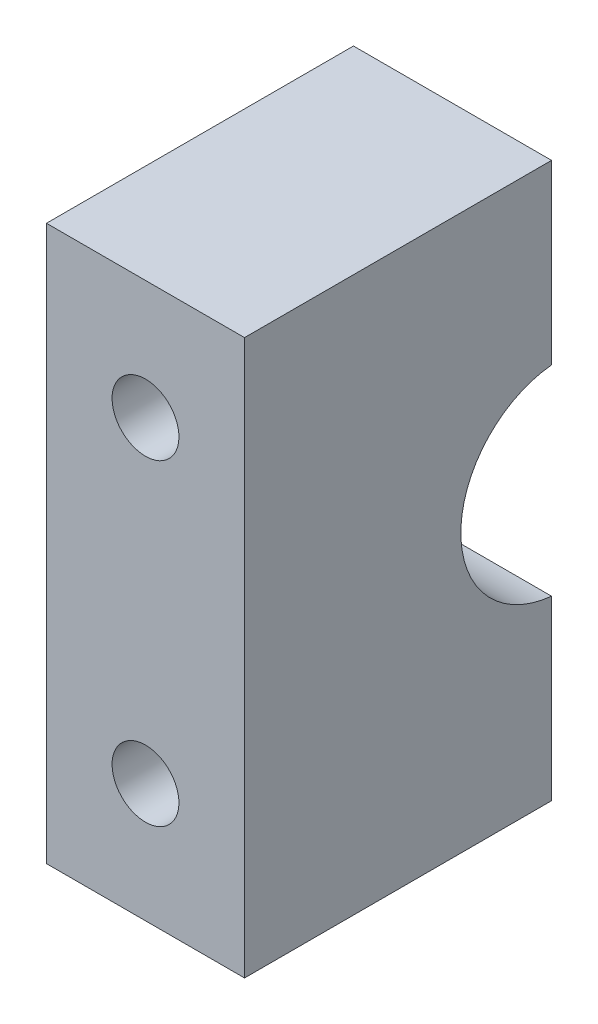
ISO-10303-21;
HEADER;
FILE_DESCRIPTION(('STEP AP214'),'2;1');
FILE_NAME('part.step','',(''),(''),'','','');
FILE_SCHEMA(('AUTOMOTIVE_DESIGN { 1 0 10303 214 1 1 1 1 }'));
ENDSEC;
DATA;
#1=APPLICATION_CONTEXT('core data for automotive mechanical design processes');
#2=APPLICATION_PROTOCOL_DEFINITION('international standard','automotive_design',2000,#1);
#3=PRODUCT_CONTEXT('',#1,'mechanical');
#4=PRODUCT('Part','Part','',(#3));
#5=PRODUCT_RELATED_PRODUCT_CATEGORY('part','',(#4));
#6=PRODUCT_DEFINITION_FORMATION('','',#4);
#7=PRODUCT_DEFINITION_CONTEXT('part definition',#1,'design');
#8=PRODUCT_DEFINITION('design','',#6,#7);
#9=PRODUCT_DEFINITION_SHAPE('','',#8);
#10=(LENGTH_UNIT() NAMED_UNIT(*) SI_UNIT(.MILLI.,.METRE.));
#11=(NAMED_UNIT(*) PLANE_ANGLE_UNIT() SI_UNIT($,.RADIAN.));
#12=(NAMED_UNIT(*) SI_UNIT($,.STERADIAN.) SOLID_ANGLE_UNIT());
#13=UNCERTAINTY_MEASURE_WITH_UNIT(LENGTH_MEASURE(1.E-05),#10,'distance_accuracy_value','');
#14=(GEOMETRIC_REPRESENTATION_CONTEXT(3) GLOBAL_UNCERTAINTY_ASSIGNED_CONTEXT((#13)) GLOBAL_UNIT_ASSIGNED_CONTEXT((#10,
#11,#12)) REPRESENTATION_CONTEXT('',''));
#15=CARTESIAN_POINT('',(0.,0.,0.));
#16=DIRECTION('',(0.,0.,1.));
#17=DIRECTION('',(1.,0.,0.));
#18=AXIS2_PLACEMENT_3D('',#15,#16,#17);
#19=CARTESIAN_POINT('',(15.875,0.,0.));
#20=DIRECTION('',(-1.,0.,0.));
#21=DIRECTION('',(0.,0.,1.));
#22=AXIS2_PLACEMENT_3D('',#19,#20,#21);
#23=CYLINDRICAL_SURFACE('',#22,16.129);
#24=CARTESIAN_POINT('',(-15.875,0.,0.));
#25=DIRECTION('',(-1.,0.,0.));
#26=DIRECTION('',(0.,0.,-1.));
#27=AXIS2_PLACEMENT_3D('',#24,#25,#26);
#28=CIRCLE('',#27,16.129);
#29=CARTESIAN_POINT('',(-15.875,-16.0506848685656,1.58749999999999));
#30=VERTEX_POINT('',#29);
#31=CARTESIAN_POINT('',(-15.875,16.0506848685656,1.58749999999999));
#32=VERTEX_POINT('',#31);
#33=EDGE_CURVE('E92',#30,#32,#28,.T.);
#34=ORIENTED_EDGE('',*,*,#33,.T.);
#35=DIRECTION('',(-1.,0.,0.));
#36=VECTOR('',#35,1.);
#37=CARTESIAN_POINT('',(15.875,16.0506848685656,1.58749999999999));
#38=LINE('',#37,#36);
#39=CARTESIAN_POINT('',(15.875,16.0506848685656,1.58749999999999));
#40=VERTEX_POINT('',#39);
#41=EDGE_CURVE('E11',#40,#32,#38,.T.);
#42=ORIENTED_EDGE('',*,*,#41,.F.);
#43=CARTESIAN_POINT('',(15.875,0.,0.));
#44=DIRECTION('',(-1.,0.,0.));
#45=DIRECTION('',(0.,0.,-1.));
#46=AXIS2_PLACEMENT_3D('',#43,#44,#45);
#47=CIRCLE('',#46,16.129);
#48=CARTESIAN_POINT('',(15.875,-16.0506848685656,1.58749999999999));
#49=VERTEX_POINT('',#48);
#50=EDGE_CURVE('E120',#49,#40,#47,.T.);
#51=ORIENTED_EDGE('',*,*,#50,.F.);
#52=DIRECTION('',(-1.,0.,0.));
#53=VECTOR('',#52,1.);
#54=CARTESIAN_POINT('',(15.875,-16.0506848685656,1.58749999999999));
#55=LINE('',#54,#53);
#56=EDGE_CURVE('E105',#49,#30,#55,.T.);
#57=ORIENTED_EDGE('',*,*,#56,.T.);
#58=EDGE_LOOP('',(#34,#42,#51,#57));
#59=FACE_BOUND('',#58,.T.);
#60=ADVANCED_FACE('F36',(#59),#23,.F.);
#61=CARTESIAN_POINT('',(15.875,44.45,1.58749999999998));
#62=DIRECTION('',(0.,0.,1.));
#63=DIRECTION('',(0.,-1.,0.));
#64=AXIS2_PLACEMENT_3D('',#61,#62,#63);
#65=PLANE('',#64);
#66=CARTESIAN_POINT('',(0.,25.4,1.58749999999998));
#67=DIRECTION('',(0.,0.,-1.));
#68=DIRECTION('',(0.,1.,0.));
#69=AXIS2_PLACEMENT_3D('',#66,#67,#68);
#70=CIRCLE('',#69,7.14375);
#71=CARTESIAN_POINT('',(0.,32.54375,1.58749999999998));
#72=VERTEX_POINT('',#71);
#73=EDGE_CURVE('E186',#72,#72,#70,.T.);
#74=ORIENTED_EDGE('',*,*,#73,.F.);
#75=EDGE_LOOP('',(#74));
#76=FACE_BOUND('',#75,.T.);
#77=DIRECTION('',(0.,1.,0.));
#78=VECTOR('',#77,1.);
#79=CARTESIAN_POINT('',(-15.875,44.45,1.58749999999998));
#80=LINE('',#79,#78);
#81=CARTESIAN_POINT('',(-15.875,44.45,1.58749999999998));
#82=VERTEX_POINT('',#81);
#83=EDGE_CURVE('E88',#32,#82,#80,.T.);
#84=ORIENTED_EDGE('',*,*,#83,.T.);
#85=DIRECTION('',(-1.,0.,0.));
#86=VECTOR('',#85,1.);
#87=CARTESIAN_POINT('',(15.875,44.45,1.58749999999998));
#88=LINE('',#87,#86);
#89=CARTESIAN_POINT('',(15.875,44.45,1.58749999999998));
#90=VERTEX_POINT('',#89);
#91=EDGE_CURVE('E43',#90,#82,#88,.T.);
#92=ORIENTED_EDGE('',*,*,#91,.F.);
#93=DIRECTION('',(0.,1.,0.));
#94=VECTOR('',#93,1.);
#95=CARTESIAN_POINT('',(15.875,44.45,1.58749999999998));
#96=LINE('',#95,#94);
#97=EDGE_CURVE('E101',#40,#90,#96,.T.);
#98=ORIENTED_EDGE('',*,*,#97,.F.);
#99=ORIENTED_EDGE('',*,*,#41,.T.);
#100=EDGE_LOOP('',(#84,#92,#98,#99));
#101=FACE_BOUND('',#100,.T.);
#102=ADVANCED_FACE('F100',(#76,#101),#65,.F.);
#103=CARTESIAN_POINT('',(15.875,44.45,1.58749999999998));
#104=DIRECTION('',(0.,-1.,0.));
#105=DIRECTION('',(0.,0.,-1.));
#106=AXIS2_PLACEMENT_3D('',#103,#104,#105);
#107=PLANE('',#106);
#108=DIRECTION('',(0.,0.,1.));
#109=VECTOR('',#108,1.);
#110=CARTESIAN_POINT('',(-15.875,44.45,1.58749999999998));
#111=LINE('',#110,#109);
#112=CARTESIAN_POINT('',(-15.875,44.45,50.8));
#113=VERTEX_POINT('',#112);
#114=EDGE_CURVE('E94',#82,#113,#111,.T.);
#115=ORIENTED_EDGE('',*,*,#114,.T.);
#116=DIRECTION('',(-1.,0.,0.));
#117=VECTOR('',#116,1.);
#118=CARTESIAN_POINT('',(15.875,44.45,50.8));
#119=LINE('',#118,#117);
#120=CARTESIAN_POINT('',(15.875,44.45,50.8));
#121=VERTEX_POINT('',#120);
#122=EDGE_CURVE('E136',#121,#113,#119,.T.);
#123=ORIENTED_EDGE('',*,*,#122,.F.);
#124=DIRECTION('',(0.,0.,1.));
#125=VECTOR('',#124,1.);
#126=CARTESIAN_POINT('',(15.875,44.45,1.58749999999998));
#127=LINE('',#126,#125);
#128=EDGE_CURVE('E123',#90,#121,#127,.T.);
#129=ORIENTED_EDGE('',*,*,#128,.F.);
#130=ORIENTED_EDGE('',*,*,#91,.T.);
#131=EDGE_LOOP('',(#115,#123,#129,#130));
#132=FACE_BOUND('',#131,.T.);
#133=ADVANCED_FACE('F140',(#132),#107,.F.);
#134=CARTESIAN_POINT('',(15.875,44.45,50.8));
#135=DIRECTION('',(0.,0.,-1.));
#136=DIRECTION('',(-1.,0.,0.));
#137=AXIS2_PLACEMENT_3D('',#134,#135,#136);
#138=PLANE('',#137);
#139=CARTESIAN_POINT('',(0.,25.4,50.8));
#140=DIRECTION('',(0.,0.,-1.));
#141=DIRECTION('',(0.,1.,0.));
#142=AXIS2_PLACEMENT_3D('',#139,#140,#141);
#143=CIRCLE('',#142,5.35812999999999);
#144=CARTESIAN_POINT('',(0.,30.75813,50.8));
#145=VERTEX_POINT('',#144);
#146=EDGE_CURVE('E180',#145,#145,#143,.T.);
#147=ORIENTED_EDGE('',*,*,#146,.T.);
#148=EDGE_LOOP('',(#147));
#149=FACE_BOUND('',#148,.T.);
#150=CARTESIAN_POINT('',(0.,-25.4,50.8));
#151=DIRECTION('',(0.,0.,-1.));
#152=DIRECTION('',(0.,1.,0.));
#153=AXIS2_PLACEMENT_3D('',#150,#151,#152);
#154=CIRCLE('',#153,5.35812999999999);
#155=CARTESIAN_POINT('',(0.,-20.04187,50.8));
#156=VERTEX_POINT('',#155);
#157=EDGE_CURVE('E183',#156,#156,#154,.T.);
#158=ORIENTED_EDGE('',*,*,#157,.T.);
#159=EDGE_LOOP('',(#158));
#160=FACE_BOUND('',#159,.T.);
#161=DIRECTION('',(0.,-1.,0.));
#162=VECTOR('',#161,1.);
#163=CARTESIAN_POINT('',(-15.875,44.45,50.8));
#164=LINE('',#163,#162);
#165=CARTESIAN_POINT('',(-15.875,-44.45,50.8));
#166=VERTEX_POINT('',#165);
#167=EDGE_CURVE('E114',#113,#166,#164,.T.);
#168=ORIENTED_EDGE('',*,*,#167,.T.);
#169=DIRECTION('',(-1.,0.,0.));
#170=VECTOR('',#169,1.);
#171=CARTESIAN_POINT('',(15.875,-44.45,50.8));
#172=LINE('',#171,#170);
#173=CARTESIAN_POINT('',(15.875,-44.45,50.8));
#174=VERTEX_POINT('',#173);
#175=EDGE_CURVE('E133',#174,#166,#172,.T.);
#176=ORIENTED_EDGE('',*,*,#175,.F.);
#177=DIRECTION('',(0.,-1.,0.));
#178=VECTOR('',#177,1.);
#179=CARTESIAN_POINT('',(15.875,44.45,50.8));
#180=LINE('',#179,#178);
#181=EDGE_CURVE('E125',#121,#174,#180,.T.);
#182=ORIENTED_EDGE('',*,*,#181,.F.);
#183=ORIENTED_EDGE('',*,*,#122,.T.);
#184=EDGE_LOOP('',(#168,#176,#182,#183));
#185=FACE_BOUND('',#184,.T.);
#186=ADVANCED_FACE('F146',(#149,#160,#185),#138,.F.);
#187=CARTESIAN_POINT('',(15.875,-44.45,50.8));
#188=DIRECTION('',(0.,1.,0.));
#189=DIRECTION('',(0.,0.,1.));
#190=AXIS2_PLACEMENT_3D('',#187,#188,#189);
#191=PLANE('',#190);
#192=DIRECTION('',(0.,0.,-1.));
#193=VECTOR('',#192,1.);
#194=CARTESIAN_POINT('',(-15.875,-44.45,50.8));
#195=LINE('',#194,#193);
#196=CARTESIAN_POINT('',(-15.875,-44.45,1.58749999999998));
#197=VERTEX_POINT('',#196);
#198=EDGE_CURVE('E116',#166,#197,#195,.T.);
#199=ORIENTED_EDGE('',*,*,#198,.T.);
#200=DIRECTION('',(-1.,0.,0.));
#201=VECTOR('',#200,1.);
#202=CARTESIAN_POINT('',(15.875,-44.45,1.58749999999998));
#203=LINE('',#202,#201);
#204=CARTESIAN_POINT('',(15.875,-44.45,1.58749999999998));
#205=VERTEX_POINT('',#204);
#206=EDGE_CURVE('E130',#205,#197,#203,.T.);
#207=ORIENTED_EDGE('',*,*,#206,.F.);
#208=DIRECTION('',(0.,0.,-1.));
#209=VECTOR('',#208,1.);
#210=CARTESIAN_POINT('',(15.875,-44.45,50.8));
#211=LINE('',#210,#209);
#212=EDGE_CURVE('E55',#174,#205,#211,.T.);
#213=ORIENTED_EDGE('',*,*,#212,.F.);
#214=ORIENTED_EDGE('',*,*,#175,.T.);
#215=EDGE_LOOP('',(#199,#207,#213,#214));
#216=FACE_BOUND('',#215,.T.);
#217=ADVANCED_FACE('F149',(#216),#191,.F.);
#218=CARTESIAN_POINT('',(15.875,-16.0506848685656,1.58749999999999));
#219=DIRECTION('',(0.,0.,1.));
#220=DIRECTION('',(0.,-1.,0.));
#221=AXIS2_PLACEMENT_3D('',#218,#219,#220);
#222=PLANE('',#221);
#223=CARTESIAN_POINT('',(0.,-25.4,1.58749999999998));
#224=DIRECTION('',(0.,0.,-1.));
#225=DIRECTION('',(0.,1.,0.));
#226=AXIS2_PLACEMENT_3D('',#223,#224,#225);
#227=CIRCLE('',#226,7.14375);
#228=CARTESIAN_POINT('',(0.,-18.25625,1.58749999999998));
#229=VERTEX_POINT('',#228);
#230=EDGE_CURVE('E106',#229,#229,#227,.T.);
#231=ORIENTED_EDGE('',*,*,#230,.F.);
#232=EDGE_LOOP('',(#231));
#233=FACE_BOUND('',#232,.T.);
#234=DIRECTION('',(0.,1.,0.));
#235=VECTOR('',#234,1.);
#236=CARTESIAN_POINT('',(-15.875,-16.0506848685656,1.58749999999999));
#237=LINE('',#236,#235);
#238=EDGE_CURVE('E118',#197,#30,#237,.T.);
#239=ORIENTED_EDGE('',*,*,#238,.T.);
#240=ORIENTED_EDGE('',*,*,#56,.F.);
#241=DIRECTION('',(0.,1.,0.));
#242=VECTOR('',#241,1.);
#243=CARTESIAN_POINT('',(15.875,-16.0506848685656,1.58749999999999));
#244=LINE('',#243,#242);
#245=EDGE_CURVE('E50',#205,#49,#244,.T.);
#246=ORIENTED_EDGE('',*,*,#245,.F.);
#247=ORIENTED_EDGE('',*,*,#206,.T.);
#248=EDGE_LOOP('',(#239,#240,#246,#247));
#249=FACE_BOUND('',#248,.T.);
#250=ADVANCED_FACE('F151',(#233,#249),#222,.F.);
#251=CARTESIAN_POINT('',(15.875,0.,0.));
#252=DIRECTION('',(1.,0.,0.));
#253=DIRECTION('',(0.,0.,-1.));
#254=AXIS2_PLACEMENT_3D('',#251,#252,#253);
#255=PLANE('',#254);
#256=ORIENTED_EDGE('',*,*,#50,.T.);
#257=ORIENTED_EDGE('',*,*,#97,.T.);
#258=ORIENTED_EDGE('',*,*,#128,.T.);
#259=ORIENTED_EDGE('',*,*,#181,.T.);
#260=ORIENTED_EDGE('',*,*,#212,.T.);
#261=ORIENTED_EDGE('',*,*,#245,.T.);
#262=EDGE_LOOP('',(#256,#257,#258,#259,#260,#261));
#263=FACE_BOUND('',#262,.T.);
#264=ADVANCED_FACE('F143',(#263),#255,.T.);
#265=CARTESIAN_POINT('',(-15.875,0.,0.));
#266=DIRECTION('',(1.,0.,0.));
#267=DIRECTION('',(0.,0.,-1.));
#268=AXIS2_PLACEMENT_3D('',#265,#266,#267);
#269=PLANE('',#268);
#270=ORIENTED_EDGE('',*,*,#33,.F.);
#271=ORIENTED_EDGE('',*,*,#238,.F.);
#272=ORIENTED_EDGE('',*,*,#198,.F.);
#273=ORIENTED_EDGE('',*,*,#167,.F.);
#274=ORIENTED_EDGE('',*,*,#114,.F.);
#275=ORIENTED_EDGE('',*,*,#83,.F.);
#276=EDGE_LOOP('',(#270,#271,#272,#273,#274,#275));
#277=FACE_BOUND('',#276,.T.);
#278=ADVANCED_FACE('F89',(#277),#269,.F.);
#279=CARTESIAN_POINT('',(0.,-25.4,1.58749999999998));
#280=DIRECTION('',(0.,0.,-1.));
#281=DIRECTION('',(0.,1.,0.));
#282=AXIS2_PLACEMENT_3D('',#279,#280,#281);
#283=CONICAL_SURFACE('',#282,7.14375,0.785398163397447);
#284=CARTESIAN_POINT('',(0.,-25.4,2.38124999999998));
#285=DIRECTION('',(0.,0.,-1.));
#286=DIRECTION('',(0.,1.,0.));
#287=AXIS2_PLACEMENT_3D('',#284,#285,#286);
#288=CIRCLE('',#287,6.35);
#289=CARTESIAN_POINT('',(0.,-19.05,2.38124999999998));
#290=VERTEX_POINT('',#289);
#291=EDGE_CURVE('E109',#290,#290,#288,.T.);
#292=ORIENTED_EDGE('',*,*,#291,.F.);
#293=EDGE_LOOP('',(#292));
#294=FACE_BOUND('',#293,.T.);
#295=ORIENTED_EDGE('',*,*,#230,.T.);
#296=EDGE_LOOP('',(#295));
#297=FACE_BOUND('',#296,.T.);
#298=ADVANCED_FACE('F202',(#294,#297),#283,.F.);
#299=CARTESIAN_POINT('',(0.,-25.4,1.58749999999998));
#300=DIRECTION('',(0.,0.,-1.));
#301=DIRECTION('',(0.,1.,0.));
#302=AXIS2_PLACEMENT_3D('',#299,#300,#301);
#303=CYLINDRICAL_SURFACE('',#302,6.35);
#304=CARTESIAN_POINT('',(0.,-25.4,26.9875));
#305=DIRECTION('',(0.,0.,-1.));
#306=DIRECTION('',(0.,1.,0.));
#307=AXIS2_PLACEMENT_3D('',#304,#305,#306);
#308=CIRCLE('',#307,6.35);
#309=CARTESIAN_POINT('',(0.,-19.05,26.9875));
#310=VERTEX_POINT('',#309);
#311=EDGE_CURVE('E189',#310,#310,#308,.T.);
#312=ORIENTED_EDGE('',*,*,#311,.F.);
#313=EDGE_LOOP('',(#312));
#314=FACE_BOUND('',#313,.T.);
#315=ORIENTED_EDGE('',*,*,#291,.T.);
#316=EDGE_LOOP('',(#315));
#317=FACE_BOUND('',#316,.T.);
#318=ADVANCED_FACE('F200',(#314,#317),#303,.F.);
#319=CARTESIAN_POINT('',(6.35,-25.4,26.9875));
#320=DIRECTION('',(0.,0.,1.));
#321=DIRECTION('',(0.,-1.,0.));
#322=AXIS2_PLACEMENT_3D('',#319,#320,#321);
#323=PLANE('',#322);
#324=CARTESIAN_POINT('',(0.,-25.4,26.9875));
#325=DIRECTION('',(0.,0.,-1.));
#326=DIRECTION('',(0.,1.,0.));
#327=AXIS2_PLACEMENT_3D('',#324,#325,#326);
#328=CIRCLE('',#327,5.35812999999999);
#329=CARTESIAN_POINT('',(0.,-20.04187,26.9875));
#330=VERTEX_POINT('',#329);
#331=EDGE_CURVE('E185',#330,#330,#328,.T.);
#332=ORIENTED_EDGE('',*,*,#331,.F.);
#333=EDGE_LOOP('',(#332));
#334=FACE_BOUND('',#333,.T.);
#335=ORIENTED_EDGE('',*,*,#311,.T.);
#336=EDGE_LOOP('',(#335));
#337=FACE_BOUND('',#336,.T.);
#338=ADVANCED_FACE('F210',(#334,#337),#323,.F.);
#339=CARTESIAN_POINT('',(0.,-25.4,1.58749999999998));
#340=DIRECTION('',(0.,0.,-1.));
#341=DIRECTION('',(0.,1.,0.));
#342=AXIS2_PLACEMENT_3D('',#339,#340,#341);
#343=CYLINDRICAL_SURFACE('',#342,5.35812999999999);
#344=ORIENTED_EDGE('',*,*,#157,.F.);
#345=EDGE_LOOP('',(#344));
#346=FACE_BOUND('',#345,.T.);
#347=ORIENTED_EDGE('',*,*,#331,.T.);
#348=EDGE_LOOP('',(#347));
#349=FACE_BOUND('',#348,.T.);
#350=ADVANCED_FACE('F217',(#346,#349),#343,.F.);
#351=CARTESIAN_POINT('',(0.,25.4,1.58749999999998));
#352=DIRECTION('',(0.,0.,-1.));
#353=DIRECTION('',(0.,1.,0.));
#354=AXIS2_PLACEMENT_3D('',#351,#352,#353);
#355=CONICAL_SURFACE('',#354,7.14375,0.785398163397447);
#356=CARTESIAN_POINT('',(0.,25.4,2.38124999999998));
#357=DIRECTION('',(0.,0.,-1.));
#358=DIRECTION('',(0.,1.,0.));
#359=AXIS2_PLACEMENT_3D('',#356,#357,#358);
#360=CIRCLE('',#359,6.35);
#361=CARTESIAN_POINT('',(0.,31.75,2.38124999999998));
#362=VERTEX_POINT('',#361);
#363=EDGE_CURVE('E192',#362,#362,#360,.T.);
#364=ORIENTED_EDGE('',*,*,#363,.F.);
#365=EDGE_LOOP('',(#364));
#366=FACE_BOUND('',#365,.T.);
#367=ORIENTED_EDGE('',*,*,#73,.T.);
#368=EDGE_LOOP('',(#367));
#369=FACE_BOUND('',#368,.T.);
#370=ADVANCED_FACE('F221',(#366,#369),#355,.F.);
#371=CARTESIAN_POINT('',(0.,25.4,1.58749999999998));
#372=DIRECTION('',(0.,0.,-1.));
#373=DIRECTION('',(0.,1.,0.));
#374=AXIS2_PLACEMENT_3D('',#371,#372,#373);
#375=CYLINDRICAL_SURFACE('',#374,6.35);
#376=CARTESIAN_POINT('',(0.,25.4,26.9875));
#377=DIRECTION('',(0.,0.,-1.));
#378=DIRECTION('',(0.,1.,0.));
#379=AXIS2_PLACEMENT_3D('',#376,#377,#378);
#380=CIRCLE('',#379,6.35);
#381=CARTESIAN_POINT('',(0.,31.75,26.9875));
#382=VERTEX_POINT('',#381);
#383=EDGE_CURVE('E242',#382,#382,#380,.T.);
#384=ORIENTED_EDGE('',*,*,#383,.F.);
#385=EDGE_LOOP('',(#384));
#386=FACE_BOUND('',#385,.T.);
#387=ORIENTED_EDGE('',*,*,#363,.T.);
#388=EDGE_LOOP('',(#387));
#389=FACE_BOUND('',#388,.T.);
#390=ADVANCED_FACE('F224',(#386,#389),#375,.F.);
#391=CARTESIAN_POINT('',(6.35,25.4,26.9875));
#392=DIRECTION('',(0.,0.,1.));
#393=DIRECTION('',(0.,-1.,0.));
#394=AXIS2_PLACEMENT_3D('',#391,#392,#393);
#395=PLANE('',#394);
#396=CARTESIAN_POINT('',(0.,25.4,26.9875));
#397=DIRECTION('',(0.,0.,-1.));
#398=DIRECTION('',(0.,1.,0.));
#399=AXIS2_PLACEMENT_3D('',#396,#397,#398);
#400=CIRCLE('',#399,5.35812999999999);
#401=CARTESIAN_POINT('',(0.,30.75813,26.9875));
#402=VERTEX_POINT('',#401);
#403=EDGE_CURVE('E241',#402,#402,#400,.T.);
#404=ORIENTED_EDGE('',*,*,#403,.F.);
#405=EDGE_LOOP('',(#404));
#406=FACE_BOUND('',#405,.T.);
#407=ORIENTED_EDGE('',*,*,#383,.T.);
#408=EDGE_LOOP('',(#407));
#409=FACE_BOUND('',#408,.T.);
#410=ADVANCED_FACE('F228',(#406,#409),#395,.F.);
#411=CARTESIAN_POINT('',(0.,25.4,1.58749999999998));
#412=DIRECTION('',(0.,0.,-1.));
#413=DIRECTION('',(0.,1.,0.));
#414=AXIS2_PLACEMENT_3D('',#411,#412,#413);
#415=CYLINDRICAL_SURFACE('',#414,5.35812999999999);
#416=ORIENTED_EDGE('',*,*,#146,.F.);
#417=EDGE_LOOP('',(#416));
#418=FACE_BOUND('',#417,.T.);
#419=ORIENTED_EDGE('',*,*,#403,.T.);
#420=EDGE_LOOP('',(#419));
#421=FACE_BOUND('',#420,.T.);
#422=ADVANCED_FACE('F232',(#418,#421),#415,.F.);
#423=CLOSED_SHELL('',(#60,#102,#133,#186,#217,#250,#264,#278,#298,#318,#338,#350,#370,#390,#410,#422));
#424=MANIFOLD_SOLID_BREP('B2',#423);
#425=ADVANCED_BREP_SHAPE_REPRESENTATION('',(#18,#424),#14);
#426=SHAPE_DEFINITION_REPRESENTATION(#9,#425);
ENDSEC;
END-ISO-10303-21;
